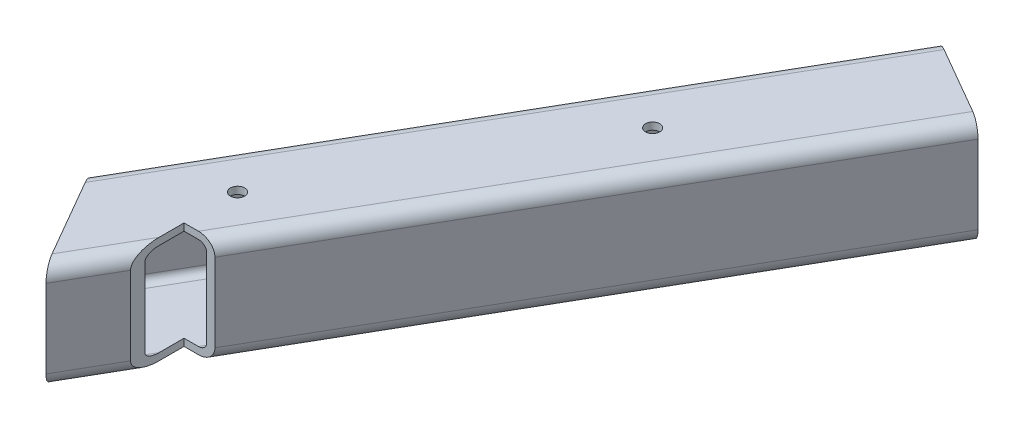
ISO-10303-21;
HEADER;
FILE_DESCRIPTION(('STEP AP214'),'2;1');
FILE_NAME('part.step','',(''),(''),'','','');
FILE_SCHEMA(('AUTOMOTIVE_DESIGN { 1 0 10303 214 1 1 1 1 }'));
ENDSEC;
DATA;
#1=APPLICATION_CONTEXT('core data for automotive mechanical design processes');
#2=APPLICATION_PROTOCOL_DEFINITION('international standard','automotive_design',2000,#1);
#3=PRODUCT_CONTEXT('',#1,'mechanical');
#4=PRODUCT('Part','Part','',(#3));
#5=PRODUCT_RELATED_PRODUCT_CATEGORY('part','',(#4));
#6=PRODUCT_DEFINITION_FORMATION('','',#4);
#7=PRODUCT_DEFINITION_CONTEXT('part definition',#1,'design');
#8=PRODUCT_DEFINITION('design','',#6,#7);
#9=PRODUCT_DEFINITION_SHAPE('','',#8);
#10=(LENGTH_UNIT() NAMED_UNIT(*) SI_UNIT(.MILLI.,.METRE.));
#11=(NAMED_UNIT(*) PLANE_ANGLE_UNIT() SI_UNIT($,.RADIAN.));
#12=(NAMED_UNIT(*) SI_UNIT($,.STERADIAN.) SOLID_ANGLE_UNIT());
#13=UNCERTAINTY_MEASURE_WITH_UNIT(LENGTH_MEASURE(1.E-05),#10,'distance_accuracy_value','');
#14=(GEOMETRIC_REPRESENTATION_CONTEXT(3) GLOBAL_UNCERTAINTY_ASSIGNED_CONTEXT((#13)) GLOBAL_UNIT_ASSIGNED_CONTEXT((#10,
#11,#12)) REPRESENTATION_CONTEXT('',''));
#15=CARTESIAN_POINT('',(0.,0.,0.));
#16=DIRECTION('',(0.,0.,1.));
#17=DIRECTION('',(1.,0.,0.));
#18=AXIS2_PLACEMENT_3D('',#15,#16,#17);
#19=CARTESIAN_POINT('',(57.5262794416286,-11.,-167.705080756888));
#20=DIRECTION('',(-0.499999999999998,0.,0.86602540378444));
#21=DIRECTION('',(0.86602540378444,0.,0.499999999999998));
#22=AXIS2_PLACEMENT_3D('',#19,#20,#21);
#23=CYLINDRICAL_SURFACE('',#22,4.);
#24=DIRECTION('',(-0.499999999999998,0.,0.86602540378444));
#25=VECTOR('',#24,1.);
#26=CARTESIAN_POINT('',(57.5262794416286,-15.,-167.705080756888));
#27=LINE('',#26,#25);
#28=CARTESIAN_POINT('',(-26.0000000000002,-15.,-23.0333209967901));
#29=VERTEX_POINT('',#28);
#30=CARTESIAN_POINT('',(-36.9888930010696,-15.,-3.9999999999997));
#31=VERTEX_POINT('',#30);
#32=EDGE_CURVE('E409',#29,#31,#27,.T.);
#33=ORIENTED_EDGE('',*,*,#32,.F.);
#34=CARTESIAN_POINT('',(-26.0000000000001,-11.,-23.0333209967901));
#35=DIRECTION('',(-1.,0.,0.));
#36=DIRECTION('',(0.,0.,1.));
#37=AXIS2_PLACEMENT_3D('',#34,#35,#36);
#38=ELLIPSE('',#37,8.00000000000002,4.);
#39=CARTESIAN_POINT('',(-26.0000000000001,-11.,-15.0333209967901));
#40=VERTEX_POINT('',#39);
#41=EDGE_CURVE('E262',#29,#40,#38,.T.);
#42=ORIENTED_EDGE('',*,*,#41,.T.);
#43=DIRECTION('',(-0.499999999999998,0.,0.86602540378444));
#44=VECTOR('',#43,1.);
#45=CARTESIAN_POINT('',(60.9903810567664,-11.,-165.705080756888));
#46=LINE('',#45,#44);
#47=CARTESIAN_POINT('',(-34.6794919243111,-11.,2.4980018054066E-13));
#48=VERTEX_POINT('',#47);
#49=EDGE_CURVE('E387',#40,#48,#46,.T.);
#50=ORIENTED_EDGE('',*,*,#49,.T.);
#51=CARTESIAN_POINT('',(-36.9888930010696,-11.,-3.9999999999997));
#52=DIRECTION('',(0.866025403784435,0.,-0.500000000000007));
#53=DIRECTION('',(0.500000000000007,0.,0.866025403784435));
#54=AXIS2_PLACEMENT_3D('',#51,#52,#53);
#55=ELLIPSE('',#54,4.61880215351699,4.);
#56=EDGE_CURVE('E313',#48,#31,#55,.T.);
#57=ORIENTED_EDGE('',*,*,#56,.T.);
#58=EDGE_LOOP('',(#33,#42,#50,#57));
#59=FACE_BOUND('',#58,.T.);
#60=ADVANCED_FACE('F35',(#59),#23,.T.);
#61=CARTESIAN_POINT('',(57.5262794416286,11.,-167.705080756888));
#62=DIRECTION('',(-0.499999999999998,0.,0.86602540378444));
#63=DIRECTION('',(0.86602540378444,0.,0.499999999999998));
#64=AXIS2_PLACEMENT_3D('',#61,#62,#63);
#65=CYLINDRICAL_SURFACE('',#64,4.);
#66=DIRECTION('',(-0.499999999999998,0.,0.86602540378444));
#67=VECTOR('',#66,1.);
#68=CARTESIAN_POINT('',(60.9903810567664,11.,-165.705080756888));
#69=LINE('',#68,#67);
#70=CARTESIAN_POINT('',(-26.0000000000001,11.,-15.0333209967901));
#71=VERTEX_POINT('',#70);
#72=CARTESIAN_POINT('',(-34.6794919243111,11.,2.77555756156289E-13));
#73=VERTEX_POINT('',#72);
#74=EDGE_CURVE('E391',#71,#73,#69,.T.);
#75=ORIENTED_EDGE('',*,*,#74,.F.);
#76=CARTESIAN_POINT('',(-26.0000000000001,11.,-23.0333209967901));
#77=DIRECTION('',(-1.,0.,0.));
#78=DIRECTION('',(0.,0.,1.));
#79=AXIS2_PLACEMENT_3D('',#76,#77,#78);
#80=ELLIPSE('',#79,8.00000000000003,4.);
#81=CARTESIAN_POINT('',(-26.0000000000001,15.,-23.0333209967901));
#82=VERTEX_POINT('',#81);
#83=EDGE_CURVE('E260',#71,#82,#80,.T.);
#84=ORIENTED_EDGE('',*,*,#83,.T.);
#85=DIRECTION('',(-0.499999999999998,0.,0.86602540378444));
#86=VECTOR('',#85,1.);
#87=CARTESIAN_POINT('',(57.5262794416286,15.,-167.705080756888));
#88=LINE('',#87,#86);
#89=CARTESIAN_POINT('',(-36.9888930010696,15.,-3.99999999999974));
#90=VERTEX_POINT('',#89);
#91=EDGE_CURVE('E230',#82,#90,#88,.T.);
#92=ORIENTED_EDGE('',*,*,#91,.T.);
#93=CARTESIAN_POINT('',(-36.9888930010696,11.,-3.9999999999997));
#94=DIRECTION('',(0.866025403784435,0.,-0.500000000000007));
#95=DIRECTION('',(0.500000000000007,0.,0.866025403784435));
#96=AXIS2_PLACEMENT_3D('',#93,#94,#95);
#97=ELLIPSE('',#96,4.61880215351699,4.);
#98=EDGE_CURVE('E310',#90,#73,#97,.T.);
#99=ORIENTED_EDGE('',*,*,#98,.T.);
#100=EDGE_LOOP('',(#75,#84,#92,#99));
#101=FACE_BOUND('',#100,.T.);
#102=ADVANCED_FACE('F483',(#101),#65,.T.);
#103=CARTESIAN_POINT('',(60.9903810567664,-11.,-165.705080756888));
#104=DIRECTION('',(-0.86602540378444,0.,-0.499999999999998));
#105=DIRECTION('',(-0.499999999999998,0.,0.86602540378444));
#106=AXIS2_PLACEMENT_3D('',#103,#104,#105);
#107=PLANE('',#106);
#108=ORIENTED_EDGE('',*,*,#49,.F.);
#109=DIRECTION('',(0.,1.,0.));
#110=VECTOR('',#109,1.);
#111=CARTESIAN_POINT('',(-26.0000000000001,-11.,-15.0333209967901));
#112=LINE('',#111,#110);
#113=EDGE_CURVE('E257',#40,#71,#112,.T.);
#114=ORIENTED_EDGE('',*,*,#113,.T.);
#115=ORIENTED_EDGE('',*,*,#74,.T.);
#116=DIRECTION('',(0.,-1.,0.));
#117=VECTOR('',#116,1.);
#118=CARTESIAN_POINT('',(-34.6794919243111,-11.,2.77555756156289E-13));
#119=LINE('',#118,#117);
#120=EDGE_CURVE('E307',#73,#48,#119,.T.);
#121=ORIENTED_EDGE('',*,*,#120,.T.);
#122=EDGE_LOOP('',(#108,#114,#115,#121));
#123=FACE_BOUND('',#122,.T.);
#124=ADVANCED_FACE('F480',(#123),#107,.F.);
#125=CARTESIAN_POINT('',(57.5262794416286,-11.,-167.705080756888));
#126=DIRECTION('',(-0.499999999999998,0.,0.86602540378444));
#127=DIRECTION('',(0.86602540378444,0.,0.499999999999998));
#128=AXIS2_PLACEMENT_3D('',#125,#126,#127);
#129=CYLINDRICAL_SURFACE('',#128,2.);
#130=CARTESIAN_POINT('',(-26.0000000000001,-11.,-23.0333209967901));
#131=DIRECTION('',(-1.,0.,0.));
#132=DIRECTION('',(0.,0.,1.));
#133=AXIS2_PLACEMENT_3D('',#130,#131,#132);
#134=ELLIPSE('',#133,4.00000000000001,2.);
#135=CARTESIAN_POINT('',(-26.0000000000001,-13.,-23.0333209967901));
#136=VERTEX_POINT('',#135);
#137=CARTESIAN_POINT('',(-26.0000000000001,-11.,-19.0333209967901));
#138=VERTEX_POINT('',#137);
#139=EDGE_CURVE('E253',#136,#138,#134,.T.);
#140=ORIENTED_EDGE('',*,*,#139,.F.);
#141=DIRECTION('',(-0.499999999999998,0.,0.86602540378444));
#142=VECTOR('',#141,1.);
#143=CARTESIAN_POINT('',(57.5262794416286,-13.,-167.705080756888));
#144=LINE('',#143,#142);
#145=CARTESIAN_POINT('',(-36.9888930010696,-13.,-3.99999999999968));
#146=VERTEX_POINT('',#145);
#147=EDGE_CURVE('E366',#136,#146,#144,.T.);
#148=ORIENTED_EDGE('',*,*,#147,.T.);
#149=CARTESIAN_POINT('',(-36.9888930010696,-11.,-3.9999999999997));
#150=DIRECTION('',(0.866025403784435,0.,-0.500000000000007));
#151=DIRECTION('',(0.500000000000007,0.,0.866025403784435));
#152=AXIS2_PLACEMENT_3D('',#149,#150,#151);
#153=ELLIPSE('',#152,2.30940107675849,2.);
#154=CARTESIAN_POINT('',(-35.8341924626903,-11.,-1.9999999999997));
#155=VERTEX_POINT('',#154);
#156=EDGE_CURVE('E304',#155,#146,#153,.T.);
#157=ORIENTED_EDGE('',*,*,#156,.F.);
#158=DIRECTION('',(-0.499999999999998,0.,0.86602540378444));
#159=VECTOR('',#158,1.);
#160=CARTESIAN_POINT('',(59.2583302491975,-11.,-166.705080756888));
#161=LINE('',#160,#159);
#162=EDGE_CURVE('E342',#138,#155,#161,.T.);
#163=ORIENTED_EDGE('',*,*,#162,.F.);
#164=EDGE_LOOP('',(#140,#148,#157,#163));
#165=FACE_BOUND('',#164,.T.);
#166=ADVANCED_FACE('F490',(#165),#129,.F.);
#167=CARTESIAN_POINT('',(57.5262794416286,11.,-167.705080756888));
#168=DIRECTION('',(-0.499999999999998,0.,0.86602540378444));
#169=DIRECTION('',(0.86602540378444,0.,0.499999999999998));
#170=AXIS2_PLACEMENT_3D('',#167,#168,#169);
#171=CYLINDRICAL_SURFACE('',#170,2.);
#172=CARTESIAN_POINT('',(-26.0000000000001,11.,-23.0333209967901));
#173=DIRECTION('',(-1.,0.,0.));
#174=DIRECTION('',(0.,0.,1.));
#175=AXIS2_PLACEMENT_3D('',#172,#173,#174);
#176=ELLIPSE('',#175,4.00000000000002,2.);
#177=CARTESIAN_POINT('',(-26.0000000000001,11.,-19.0333209967901));
#178=VERTEX_POINT('',#177);
#179=CARTESIAN_POINT('',(-26.0000000000001,13.,-23.0333209967901));
#180=VERTEX_POINT('',#179);
#181=EDGE_CURVE('E250',#178,#180,#176,.T.);
#182=ORIENTED_EDGE('',*,*,#181,.F.);
#183=DIRECTION('',(-0.499999999999998,0.,0.86602540378444));
#184=VECTOR('',#183,1.);
#185=CARTESIAN_POINT('',(59.2583302491975,11.,-166.705080756888));
#186=LINE('',#185,#184);
#187=CARTESIAN_POINT('',(-35.8341924626903,11.,-1.99999999999972));
#188=VERTEX_POINT('',#187);
#189=EDGE_CURVE('E346',#178,#188,#186,.T.);
#190=ORIENTED_EDGE('',*,*,#189,.T.);
#191=CARTESIAN_POINT('',(-36.9888930010696,11.,-3.9999999999997));
#192=DIRECTION('',(0.866025403784435,0.,-0.500000000000007));
#193=DIRECTION('',(0.500000000000007,0.,0.866025403784435));
#194=AXIS2_PLACEMENT_3D('',#191,#192,#193);
#195=ELLIPSE('',#194,2.3094010767585,2.);
#196=CARTESIAN_POINT('',(-36.9888930010696,13.,-3.99999999999973));
#197=VERTEX_POINT('',#196);
#198=EDGE_CURVE('E290',#197,#188,#195,.T.);
#199=ORIENTED_EDGE('',*,*,#198,.F.);
#200=DIRECTION('',(-0.499999999999998,0.,0.86602540378444));
#201=VECTOR('',#200,1.);
#202=CARTESIAN_POINT('',(57.5262794416286,13.,-167.705080756888));
#203=LINE('',#202,#201);
#204=EDGE_CURVE('E350',#180,#197,#203,.T.);
#205=ORIENTED_EDGE('',*,*,#204,.F.);
#206=EDGE_LOOP('',(#182,#190,#199,#205));
#207=FACE_BOUND('',#206,.T.);
#208=ADVANCED_FACE('F555',(#207),#171,.F.);
#209=CARTESIAN_POINT('',(59.2583302491975,-11.,-166.705080756888));
#210=DIRECTION('',(-0.86602540378444,0.,-0.499999999999998));
#211=DIRECTION('',(-0.499999999999998,0.,0.86602540378444));
#212=AXIS2_PLACEMENT_3D('',#209,#210,#211);
#213=PLANE('',#212);
#214=DIRECTION('',(0.,1.,0.));
#215=VECTOR('',#214,1.);
#216=CARTESIAN_POINT('',(-26.0000000000001,-11.0000000000001,-19.0333209967901));
#217=LINE('',#216,#215);
#218=EDGE_CURVE('E11',#138,#178,#217,.T.);
#219=ORIENTED_EDGE('',*,*,#218,.F.);
#220=ORIENTED_EDGE('',*,*,#162,.T.);
#221=DIRECTION('',(0.,-1.,0.));
#222=VECTOR('',#221,1.);
#223=CARTESIAN_POINT('',(-35.8341924626903,-11.,-1.9999999999997));
#224=LINE('',#223,#222);
#225=EDGE_CURVE('E413',#188,#155,#224,.T.);
#226=ORIENTED_EDGE('',*,*,#225,.F.);
#227=ORIENTED_EDGE('',*,*,#189,.F.);
#228=EDGE_LOOP('',(#219,#220,#226,#227));
#229=FACE_BOUND('',#228,.T.);
#230=ADVANCED_FACE('F574',(#229),#213,.T.);
#231=CARTESIAN_POINT('',(57.5262794416286,-11.,-167.705080756888));
#232=DIRECTION('',(-0.499999999999998,0.,0.86602540378444));
#233=DIRECTION('',(0.86602540378444,0.,0.499999999999998));
#234=AXIS2_PLACEMENT_3D('',#231,#232,#233);
#235=PLANE('',#234);
#236=CARTESIAN_POINT('',(57.5262794416286,-11.,-167.705080756888));
#237=DIRECTION('',(0.499999999999998,0.,-0.86602540378444));
#238=DIRECTION('',(0.86602540378444,0.,0.499999999999998));
#239=AXIS2_PLACEMENT_3D('',#236,#237,#238);
#240=CIRCLE('',#239,4.);
#241=CARTESIAN_POINT('',(60.9903810567664,-11.,-165.705080756888));
#242=VERTEX_POINT('',#241);
#243=CARTESIAN_POINT('',(57.5262794416286,-15.,-167.705080756888));
#244=VERTEX_POINT('',#243);
#245=EDGE_CURVE('E370',#242,#244,#240,.T.);
#246=ORIENTED_EDGE('',*,*,#245,.T.);
#247=DIRECTION('',(-0.86602540378444,0.,-0.499999999999998));
#248=VECTOR('',#247,1.);
#249=CARTESIAN_POINT('',(57.5262794416286,-15.,-167.705080756888));
#250=LINE('',#249,#248);
#251=CARTESIAN_POINT('',(38.473720558371,-15.,-178.705080756888));
#252=VERTEX_POINT('',#251);
#253=EDGE_CURVE('E373',#244,#252,#250,.T.);
#254=ORIENTED_EDGE('',*,*,#253,.T.);
#255=CARTESIAN_POINT('',(38.4737205583709,-11.,-178.705080756888));
#256=DIRECTION('',(0.499999999999998,0.,-0.86602540378444));
#257=DIRECTION('',(-0.86602540378444,0.,-0.499999999999998));
#258=AXIS2_PLACEMENT_3D('',#255,#256,#257);
#259=CIRCLE('',#258,4.);
#260=CARTESIAN_POINT('',(35.0096189432332,-11.,-180.705080756888));
#261=VERTEX_POINT('',#260);
#262=EDGE_CURVE('E375',#252,#261,#259,.T.);
#263=ORIENTED_EDGE('',*,*,#262,.T.);
#264=DIRECTION('',(0.,1.,0.));
#265=VECTOR('',#264,1.);
#266=CARTESIAN_POINT('',(35.0096189432332,-11.,-180.705080756888));
#267=LINE('',#266,#265);
#268=CARTESIAN_POINT('',(35.0096189432332,11.,-180.705080756888));
#269=VERTEX_POINT('',#268);
#270=EDGE_CURVE('E377',#261,#269,#267,.T.);
#271=ORIENTED_EDGE('',*,*,#270,.T.);
#272=CARTESIAN_POINT('',(38.4737205583709,11.,-178.705080756888));
#273=DIRECTION('',(0.499999999999998,0.,-0.86602540378444));
#274=DIRECTION('',(0.86602540378444,0.,0.499999999999998));
#275=AXIS2_PLACEMENT_3D('',#272,#273,#274);
#276=CIRCLE('',#275,4.);
#277=CARTESIAN_POINT('',(38.473720558371,15.,-178.705080756888));
#278=VERTEX_POINT('',#277);
#279=EDGE_CURVE('E379',#269,#278,#276,.T.);
#280=ORIENTED_EDGE('',*,*,#279,.T.);
#281=DIRECTION('',(0.86602540378444,0.,0.499999999999998));
#282=VECTOR('',#281,1.);
#283=CARTESIAN_POINT('',(57.5262794416286,15.,-167.705080756888));
#284=LINE('',#283,#282);
#285=CARTESIAN_POINT('',(57.5262794416286,15.,-167.705080756888));
#286=VERTEX_POINT('',#285);
#287=EDGE_CURVE('E381',#278,#286,#284,.T.);
#288=ORIENTED_EDGE('',*,*,#287,.T.);
#289=CARTESIAN_POINT('',(57.5262794416286,11.,-167.705080756888));
#290=DIRECTION('',(0.499999999999998,0.,-0.86602540378444));
#291=DIRECTION('',(0.86602540378444,0.,0.499999999999998));
#292=AXIS2_PLACEMENT_3D('',#289,#290,#291);
#293=CIRCLE('',#292,4.);
#294=CARTESIAN_POINT('',(60.9903810567664,11.,-165.705080756888));
#295=VERTEX_POINT('',#294);
#296=EDGE_CURVE('E383',#286,#295,#293,.T.);
#297=ORIENTED_EDGE('',*,*,#296,.T.);
#298=DIRECTION('',(0.,-1.,0.));
#299=VECTOR('',#298,1.);
#300=CARTESIAN_POINT('',(60.9903810567664,-11.,-165.705080756888));
#301=LINE('',#300,#299);
#302=EDGE_CURVE('E385',#295,#242,#301,.T.);
#303=ORIENTED_EDGE('',*,*,#302,.T.);
#304=EDGE_LOOP('',(#246,#254,#263,#271,#280,#288,#297,#303));
#305=FACE_BOUND('',#304,.T.);
#306=CARTESIAN_POINT('',(57.5262794416286,-11.,-167.705080756888));
#307=DIRECTION('',(0.499999999999998,0.,-0.86602540378444));
#308=DIRECTION('',(0.86602540378444,0.,0.499999999999998));
#309=AXIS2_PLACEMENT_3D('',#306,#307,#308);
#310=CIRCLE('',#309,2.);
#311=CARTESIAN_POINT('',(59.2583302491975,-11.,-166.705080756888));
#312=VERTEX_POINT('',#311);
#313=CARTESIAN_POINT('',(57.5262794416286,-13.,-167.705080756888));
#314=VERTEX_POINT('',#313);
#315=EDGE_CURVE('E325',#312,#314,#310,.T.);
#316=ORIENTED_EDGE('',*,*,#315,.F.);
#317=DIRECTION('',(0.,-1.,0.));
#318=VECTOR('',#317,1.);
#319=CARTESIAN_POINT('',(59.2583302491975,-11.,-166.705080756888));
#320=LINE('',#319,#318);
#321=CARTESIAN_POINT('',(59.2583302491975,11.,-166.705080756888));
#322=VERTEX_POINT('',#321);
#323=EDGE_CURVE('E340',#322,#312,#320,.T.);
#324=ORIENTED_EDGE('',*,*,#323,.F.);
#325=CARTESIAN_POINT('',(57.5262794416286,11.,-167.705080756888));
#326=DIRECTION('',(0.499999999999998,0.,-0.86602540378444));
#327=DIRECTION('',(0.86602540378444,0.,0.499999999999998));
#328=AXIS2_PLACEMENT_3D('',#325,#326,#327);
#329=CIRCLE('',#328,2.);
#330=CARTESIAN_POINT('',(57.5262794416286,13.,-167.705080756888));
#331=VERTEX_POINT('',#330);
#332=EDGE_CURVE('E337',#331,#322,#329,.T.);
#333=ORIENTED_EDGE('',*,*,#332,.F.);
#334=DIRECTION('',(0.86602540378444,0.,0.499999999999998));
#335=VECTOR('',#334,1.);
#336=CARTESIAN_POINT('',(57.5262794416286,13.,-167.705080756888));
#337=LINE('',#336,#335);
#338=CARTESIAN_POINT('',(38.473720558371,13.,-178.705080756888));
#339=VERTEX_POINT('',#338);
#340=EDGE_CURVE('E335',#339,#331,#337,.T.);
#341=ORIENTED_EDGE('',*,*,#340,.F.);
#342=CARTESIAN_POINT('',(38.4737205583709,11.,-178.705080756888));
#343=DIRECTION('',(0.499999999999998,0.,-0.86602540378444));
#344=DIRECTION('',(0.86602540378444,0.,0.499999999999998));
#345=AXIS2_PLACEMENT_3D('',#342,#343,#344);
#346=CIRCLE('',#345,2.);
#347=CARTESIAN_POINT('',(36.7416697508021,11.,-179.705080756888));
#348=VERTEX_POINT('',#347);
#349=EDGE_CURVE('E333',#348,#339,#346,.T.);
#350=ORIENTED_EDGE('',*,*,#349,.F.);
#351=DIRECTION('',(0.,1.,0.));
#352=VECTOR('',#351,1.);
#353=CARTESIAN_POINT('',(36.7416697508021,-11.,-179.705080756888));
#354=LINE('',#353,#352);
#355=CARTESIAN_POINT('',(36.7416697508021,-11.,-179.705080756888));
#356=VERTEX_POINT('',#355);
#357=EDGE_CURVE('E331',#356,#348,#354,.T.);
#358=ORIENTED_EDGE('',*,*,#357,.F.);
#359=CARTESIAN_POINT('',(38.4737205583709,-11.,-178.705080756888));
#360=DIRECTION('',(0.499999999999998,0.,-0.86602540378444));
#361=DIRECTION('',(-0.86602540378444,0.,-0.499999999999998));
#362=AXIS2_PLACEMENT_3D('',#359,#360,#361);
#363=CIRCLE('',#362,2.);
#364=CARTESIAN_POINT('',(38.473720558371,-13.,-178.705080756888));
#365=VERTEX_POINT('',#364);
#366=EDGE_CURVE('E329',#365,#356,#363,.T.);
#367=ORIENTED_EDGE('',*,*,#366,.F.);
#368=DIRECTION('',(-0.86602540378444,0.,-0.499999999999998));
#369=VECTOR('',#368,1.);
#370=CARTESIAN_POINT('',(57.5262794416286,-13.,-167.705080756888));
#371=LINE('',#370,#369);
#372=EDGE_CURVE('E327',#314,#365,#371,.T.);
#373=ORIENTED_EDGE('',*,*,#372,.F.);
#374=EDGE_LOOP('',(#316,#324,#333,#341,#350,#358,#367,#373));
#375=FACE_BOUND('',#374,.T.);
#376=ADVANCED_FACE('F431',(#305,#375),#235,.F.);
#377=CARTESIAN_POINT('',(-17.3397459621554,-11.,-30.0333209967908));
#378=VERTEX_POINT('',#377);
#379=EDGE_CURVE('E388',#242,#378,#46,.T.);
#380=ORIENTED_EDGE('',*,*,#379,.T.);
#381=CARTESIAN_POINT('',(-21.9585481156724,-11.,-30.0333209967907));
#382=DIRECTION('',(0.,0.,-1.));
#383=DIRECTION('',(-1.,0.,0.));
#384=AXIS2_PLACEMENT_3D('',#381,#382,#383);
#385=ELLIPSE('',#384,4.618802153517,4.);
#386=CARTESIAN_POINT('',(-21.9585481156724,-15.,-30.0333209967908));
#387=VERTEX_POINT('',#386);
#388=EDGE_CURVE('E50',#378,#387,#385,.T.);
#389=ORIENTED_EDGE('',*,*,#388,.T.);
#390=EDGE_CURVE('E410',#244,#387,#27,.T.);
#391=ORIENTED_EDGE('',*,*,#390,.F.);
#392=ORIENTED_EDGE('',*,*,#245,.F.);
#393=EDGE_LOOP('',(#380,#389,#391,#392));
#394=FACE_BOUND('',#393,.T.);
#395=ADVANCED_FACE('F37',(#394),#23,.T.);
#396=CARTESIAN_POINT('',(57.5262794416286,-15.,-167.705080756888));
#397=DIRECTION('',(0.,1.,0.));
#398=DIRECTION('',(0.,0.,1.));
#399=AXIS2_PLACEMENT_3D('',#396,#397,#398);
#400=PLANE('',#399);
#401=CARTESIAN_POINT('',(-26.0000000000002,-15.,-45.0333209967906));
#402=DIRECTION('',(0.,1.,0.));
#403=DIRECTION('',(0.,0.,1.));
#404=AXIS2_PLACEMENT_3D('',#401,#402,#403);
#405=CIRCLE('',#404,2.);
#406=CARTESIAN_POINT('',(-26.0000000000002,-15.,-43.0333209967906));
#407=VERTEX_POINT('',#406);
#408=EDGE_CURVE('E269',#407,#407,#405,.T.);
#409=ORIENTED_EDGE('',*,*,#408,.T.);
#410=EDGE_LOOP('',(#409));
#411=FACE_BOUND('',#410,.T.);
#412=CARTESIAN_POINT('',(16.6147462459374,-15.,-118.844226646409));
#413=DIRECTION('',(0.,1.,0.));
#414=DIRECTION('',(0.,0.,1.));
#415=AXIS2_PLACEMENT_3D('',#412,#413,#414);
#416=CIRCLE('',#415,2.00000000000002);
#417=CARTESIAN_POINT('',(16.6147462459374,-15.,-116.844226646409));
#418=VERTEX_POINT('',#417);
#419=EDGE_CURVE('E270',#418,#418,#416,.T.);
#420=ORIENTED_EDGE('',*,*,#419,.T.);
#421=EDGE_LOOP('',(#420));
#422=FACE_BOUND('',#421,.T.);
#423=DIRECTION('',(-1.,0.,0.));
#424=VECTOR('',#423,1.);
#425=CARTESIAN_POINT('',(25.9999999999998,-15.,-30.0333209967908));
#426=LINE('',#425,#424);
#427=CARTESIAN_POINT('',(-26.0000000000002,-15.,-30.0333209967908));
#428=VERTEX_POINT('',#427);
#429=EDGE_CURVE('E231',#387,#428,#426,.T.);
#430=ORIENTED_EDGE('',*,*,#429,.T.);
#431=DIRECTION('',(0.,0.,1.));
#432=VECTOR('',#431,1.);
#433=CARTESIAN_POINT('',(-26.0000000000002,-15.,-30.0333209967908));
#434=LINE('',#433,#432);
#435=EDGE_CURVE('E225',#428,#29,#434,.T.);
#436=ORIENTED_EDGE('',*,*,#435,.T.);
#437=ORIENTED_EDGE('',*,*,#32,.T.);
#438=DIRECTION('',(-0.500000000000007,0.,-0.866025403784435));
#439=VECTOR('',#438,1.);
#440=CARTESIAN_POINT('',(2.85111161261304,-15.,65.0049121646758));
#441=LINE('',#440,#439);
#442=CARTESIAN_POINT('',(-49.6905989232415,-15.,-25.9999999999996));
#443=VERTEX_POINT('',#442);
#444=EDGE_CURVE('E287',#31,#443,#441,.T.);
#445=ORIENTED_EDGE('',*,*,#444,.T.);
#446=DIRECTION('',(-0.499999999999998,0.,0.86602540378444));
#447=VECTOR('',#446,1.);
#448=CARTESIAN_POINT('',(38.473720558371,-15.,-178.705080756888));
#449=LINE('',#448,#447);
#450=EDGE_CURVE('E406',#252,#443,#449,.T.);
#451=ORIENTED_EDGE('',*,*,#450,.F.);
#452=ORIENTED_EDGE('',*,*,#253,.F.);
#453=ORIENTED_EDGE('',*,*,#390,.T.);
#454=EDGE_LOOP('',(#430,#436,#437,#445,#451,#452,#453));
#455=FACE_BOUND('',#454,.T.);
#456=ADVANCED_FACE('F444',(#411,#422,#455),#400,.F.);
#457=CARTESIAN_POINT('',(38.4737205583709,-11.,-178.705080756888));
#458=DIRECTION('',(-0.499999999999998,0.,0.86602540378444));
#459=DIRECTION('',(0.86602540378444,0.,0.499999999999998));
#460=AXIS2_PLACEMENT_3D('',#457,#458,#459);
#461=CYLINDRICAL_SURFACE('',#460,4.);
#462=ORIENTED_EDGE('',*,*,#450,.T.);
#463=CARTESIAN_POINT('',(-49.6905989232415,-11.,-25.9999999999995));
#464=DIRECTION('',(0.866025403784435,0.,-0.500000000000007));
#465=DIRECTION('',(0.500000000000007,0.,0.866025403784435));
#466=AXIS2_PLACEMENT_3D('',#463,#464,#465);
#467=ELLIPSE('',#466,4.61880215351699,4.);
#468=CARTESIAN_POINT('',(-52.,-11.,-29.9999999999995));
#469=VERTEX_POINT('',#468);
#470=EDGE_CURVE('E322',#443,#469,#467,.T.);
#471=ORIENTED_EDGE('',*,*,#470,.T.);
#472=DIRECTION('',(-0.499999999999998,0.,0.86602540378444));
#473=VECTOR('',#472,1.);
#474=CARTESIAN_POINT('',(35.0096189432332,-11.,-180.705080756888));
#475=LINE('',#474,#473);
#476=EDGE_CURVE('E403',#261,#469,#475,.T.);
#477=ORIENTED_EDGE('',*,*,#476,.F.);
#478=ORIENTED_EDGE('',*,*,#262,.F.);
#479=EDGE_LOOP('',(#462,#471,#477,#478));
#480=FACE_BOUND('',#479,.T.);
#481=ADVANCED_FACE('F473',(#480),#461,.T.);
#482=CARTESIAN_POINT('',(35.0096189432332,-11.,-180.705080756888));
#483=DIRECTION('',(0.86602540378444,0.,0.499999999999998));
#484=DIRECTION('',(0.499999999999998,0.,-0.86602540378444));
#485=AXIS2_PLACEMENT_3D('',#482,#483,#484);
#486=PLANE('',#485);
#487=ORIENTED_EDGE('',*,*,#476,.T.);
#488=DIRECTION('',(0.,1.,0.));
#489=VECTOR('',#488,1.);
#490=CARTESIAN_POINT('',(-52.,-11.,-29.9999999999995));
#491=LINE('',#490,#489);
#492=CARTESIAN_POINT('',(-52.,11.,-29.9999999999995));
#493=VERTEX_POINT('',#492);
#494=EDGE_CURVE('E319',#469,#493,#491,.T.);
#495=ORIENTED_EDGE('',*,*,#494,.T.);
#496=DIRECTION('',(-0.499999999999998,0.,0.86602540378444));
#497=VECTOR('',#496,1.);
#498=CARTESIAN_POINT('',(35.0096189432332,11.,-180.705080756888));
#499=LINE('',#498,#497);
#500=EDGE_CURVE('E400',#269,#493,#499,.T.);
#501=ORIENTED_EDGE('',*,*,#500,.F.);
#502=ORIENTED_EDGE('',*,*,#270,.F.);
#503=EDGE_LOOP('',(#487,#495,#501,#502));
#504=FACE_BOUND('',#503,.T.);
#505=ADVANCED_FACE('F469',(#504),#486,.F.);
#506=CARTESIAN_POINT('',(38.4737205583709,11.,-178.705080756888));
#507=DIRECTION('',(-0.499999999999998,0.,0.86602540378444));
#508=DIRECTION('',(0.86602540378444,0.,0.499999999999998));
#509=AXIS2_PLACEMENT_3D('',#506,#507,#508);
#510=CYLINDRICAL_SURFACE('',#509,4.);
#511=ORIENTED_EDGE('',*,*,#500,.T.);
#512=CARTESIAN_POINT('',(-49.6905989232415,11.,-25.9999999999995));
#513=DIRECTION('',(0.866025403784435,0.,-0.500000000000007));
#514=DIRECTION('',(0.500000000000007,0.,0.866025403784435));
#515=AXIS2_PLACEMENT_3D('',#512,#513,#514);
#516=ELLIPSE('',#515,4.61880215351699,4.);
#517=CARTESIAN_POINT('',(-49.6905989232414,15.,-25.9999999999994));
#518=VERTEX_POINT('',#517);
#519=EDGE_CURVE('E316',#493,#518,#516,.T.);
#520=ORIENTED_EDGE('',*,*,#519,.T.);
#521=DIRECTION('',(-0.499999999999998,0.,0.86602540378444));
#522=VECTOR('',#521,1.);
#523=CARTESIAN_POINT('',(38.473720558371,15.,-178.705080756888));
#524=LINE('',#523,#522);
#525=EDGE_CURVE('E397',#278,#518,#524,.T.);
#526=ORIENTED_EDGE('',*,*,#525,.F.);
#527=ORIENTED_EDGE('',*,*,#279,.F.);
#528=EDGE_LOOP('',(#511,#520,#526,#527));
#529=FACE_BOUND('',#528,.T.);
#530=ADVANCED_FACE('F463',(#529),#510,.T.);
#531=CARTESIAN_POINT('',(57.5262794416286,15.,-167.705080756888));
#532=DIRECTION('',(0.,-1.,0.));
#533=DIRECTION('',(0.,0.,-1.));
#534=AXIS2_PLACEMENT_3D('',#531,#532,#533);
#535=PLANE('',#534);
#536=CARTESIAN_POINT('',(-26.0000000000002,15.,-45.0333209967906));
#537=DIRECTION('',(0.,1.,0.));
#538=DIRECTION('',(0.,0.,1.));
#539=AXIS2_PLACEMENT_3D('',#536,#537,#538);
#540=CIRCLE('',#539,2.);
#541=CARTESIAN_POINT('',(-26.0000000000002,15.,-43.0333209967906));
#542=VERTEX_POINT('',#541);
#543=EDGE_CURVE('E266',#542,#542,#540,.T.);
#544=ORIENTED_EDGE('',*,*,#543,.F.);
#545=EDGE_LOOP('',(#544));
#546=FACE_BOUND('',#545,.T.);
#547=CARTESIAN_POINT('',(16.6147462459374,15.,-118.844226646409));
#548=DIRECTION('',(0.,1.,0.));
#549=DIRECTION('',(0.,0.,1.));
#550=AXIS2_PLACEMENT_3D('',#547,#548,#549);
#551=CIRCLE('',#550,2.00000000000002);
#552=CARTESIAN_POINT('',(16.6147462459374,15.,-116.844226646409));
#553=VERTEX_POINT('',#552);
#554=EDGE_CURVE('E265',#553,#553,#551,.T.);
#555=ORIENTED_EDGE('',*,*,#554,.F.);
#556=EDGE_LOOP('',(#555));
#557=FACE_BOUND('',#556,.T.);
#558=ORIENTED_EDGE('',*,*,#91,.F.);
#559=DIRECTION('',(0.,0.,1.));
#560=VECTOR('',#559,1.);
#561=CARTESIAN_POINT('',(-26.0000000000002,15.,-30.0333209967908));
#562=LINE('',#561,#560);
#563=CARTESIAN_POINT('',(-26.0000000000002,15.,-30.0333209967908));
#564=VERTEX_POINT('',#563);
#565=EDGE_CURVE('E216',#564,#82,#562,.T.);
#566=ORIENTED_EDGE('',*,*,#565,.F.);
#567=DIRECTION('',(-1.,0.,0.));
#568=VECTOR('',#567,1.);
#569=CARTESIAN_POINT('',(25.9999999999998,15.,-30.0333209967908));
#570=LINE('',#569,#568);
#571=CARTESIAN_POINT('',(-21.9585481156724,15.,-30.0333209967908));
#572=VERTEX_POINT('',#571);
#573=EDGE_CURVE('E205',#572,#564,#570,.T.);
#574=ORIENTED_EDGE('',*,*,#573,.F.);
#575=EDGE_CURVE('E395',#286,#572,#88,.T.);
#576=ORIENTED_EDGE('',*,*,#575,.F.);
#577=ORIENTED_EDGE('',*,*,#287,.F.);
#578=ORIENTED_EDGE('',*,*,#525,.T.);
#579=DIRECTION('',(-0.500000000000007,0.,-0.866025403784435));
#580=VECTOR('',#579,1.);
#581=CARTESIAN_POINT('',(2.85111161261304,15.,65.0049121646758));
#582=LINE('',#581,#580);
#583=EDGE_CURVE('E285',#90,#518,#582,.T.);
#584=ORIENTED_EDGE('',*,*,#583,.F.);
#585=EDGE_LOOP('',(#558,#566,#574,#576,#577,#578,#584));
#586=FACE_BOUND('',#585,.T.);
#587=ADVANCED_FACE('F228',(#546,#557,#586),#535,.F.);
#588=ORIENTED_EDGE('',*,*,#575,.T.);
#589=CARTESIAN_POINT('',(-21.9585481156724,11.,-30.0333209967907));
#590=DIRECTION('',(0.,0.,-1.));
#591=DIRECTION('',(-1.,0.,0.));
#592=AXIS2_PLACEMENT_3D('',#589,#590,#591);
#593=ELLIPSE('',#592,4.618802153517,4.);
#594=CARTESIAN_POINT('',(-17.3397459621554,11.,-30.0333209967908));
#595=VERTEX_POINT('',#594);
#596=EDGE_CURVE('E211',#572,#595,#593,.T.);
#597=ORIENTED_EDGE('',*,*,#596,.T.);
#598=EDGE_CURVE('E392',#295,#595,#69,.T.);
#599=ORIENTED_EDGE('',*,*,#598,.F.);
#600=ORIENTED_EDGE('',*,*,#296,.F.);
#601=EDGE_LOOP('',(#588,#597,#599,#600));
#602=FACE_BOUND('',#601,.T.);
#603=ADVANCED_FACE('F454',(#602),#65,.T.);
#604=ORIENTED_EDGE('',*,*,#598,.T.);
#605=DIRECTION('',(0.,-1.,0.));
#606=VECTOR('',#605,1.);
#607=CARTESIAN_POINT('',(-17.3397459621554,-11.,-30.0333209967908));
#608=LINE('',#607,#606);
#609=EDGE_CURVE('E246',#595,#378,#608,.T.);
#610=ORIENTED_EDGE('',*,*,#609,.T.);
#611=ORIENTED_EDGE('',*,*,#379,.F.);
#612=ORIENTED_EDGE('',*,*,#302,.F.);
#613=EDGE_LOOP('',(#604,#610,#611,#612));
#614=FACE_BOUND('',#613,.T.);
#615=ADVANCED_FACE('F451',(#614),#107,.F.);
#616=CARTESIAN_POINT('',(-21.9585481156724,-11.,-30.0333209967907));
#617=DIRECTION('',(0.,0.,-1.));
#618=DIRECTION('',(-1.,0.,0.));
#619=AXIS2_PLACEMENT_3D('',#616,#617,#618);
#620=ELLIPSE('',#619,2.3094010767585,2.);
#621=CARTESIAN_POINT('',(-19.6491470389139,-11.,-30.0333209967907));
#622=VERTEX_POINT('',#621);
#623=CARTESIAN_POINT('',(-21.9585481156725,-13.,-30.0333209967907));
#624=VERTEX_POINT('',#623);
#625=EDGE_CURVE('E242',#622,#624,#620,.T.);
#626=ORIENTED_EDGE('',*,*,#625,.F.);
#627=EDGE_CURVE('E343',#312,#622,#161,.T.);
#628=ORIENTED_EDGE('',*,*,#627,.F.);
#629=ORIENTED_EDGE('',*,*,#315,.T.);
#630=EDGE_CURVE('E367',#314,#624,#144,.T.);
#631=ORIENTED_EDGE('',*,*,#630,.T.);
#632=EDGE_LOOP('',(#626,#628,#629,#631));
#633=FACE_BOUND('',#632,.T.);
#634=ADVANCED_FACE('F424',(#633),#129,.F.);
#635=CARTESIAN_POINT('',(57.5262794416286,-13.,-167.705080756888));
#636=DIRECTION('',(0.,1.,0.));
#637=DIRECTION('',(0.,0.,1.));
#638=AXIS2_PLACEMENT_3D('',#635,#636,#637);
#639=PLANE('',#638);
#640=DIRECTION('',(0.,0.,1.));
#641=VECTOR('',#640,1.);
#642=CARTESIAN_POINT('',(-26.0000000000002,-13.,-167.705080756888));
#643=LINE('',#642,#641);
#644=CARTESIAN_POINT('',(-26.0000000000002,-13.,-30.0333209967908));
#645=VERTEX_POINT('',#644);
#646=EDGE_CURVE('E255',#645,#136,#643,.T.);
#647=ORIENTED_EDGE('',*,*,#646,.F.);
#648=DIRECTION('',(-1.,0.,0.));
#649=VECTOR('',#648,1.);
#650=CARTESIAN_POINT('',(57.5262794416286,-13.,-30.0333209967908));
#651=LINE('',#650,#649);
#652=EDGE_CURVE('E244',#624,#645,#651,.T.);
#653=ORIENTED_EDGE('',*,*,#652,.F.);
#654=ORIENTED_EDGE('',*,*,#630,.F.);
#655=ORIENTED_EDGE('',*,*,#372,.T.);
#656=DIRECTION('',(-0.499999999999998,0.,0.86602540378444));
#657=VECTOR('',#656,1.);
#658=CARTESIAN_POINT('',(38.473720558371,-13.,-178.705080756888));
#659=LINE('',#658,#657);
#660=CARTESIAN_POINT('',(-49.6905989232415,-13.,-25.9999999999995));
#661=VERTEX_POINT('',#660);
#662=EDGE_CURVE('E363',#365,#661,#659,.T.);
#663=ORIENTED_EDGE('',*,*,#662,.T.);
#664=DIRECTION('',(-0.500000000000007,0.,-0.866025403784435));
#665=VECTOR('',#664,1.);
#666=CARTESIAN_POINT('',(-84.246479222419,-13.,-85.8525403784424));
#667=LINE('',#666,#665);
#668=EDGE_CURVE('E302',#146,#661,#667,.T.);
#669=ORIENTED_EDGE('',*,*,#668,.F.);
#670=ORIENTED_EDGE('',*,*,#147,.F.);
#671=EDGE_LOOP('',(#647,#653,#654,#655,#663,#669,#670));
#672=FACE_BOUND('',#671,.T.);
#673=CARTESIAN_POINT('',(-26.0000000000002,-13.,-45.0333209967906));
#674=DIRECTION('',(0.,1.,0.));
#675=DIRECTION('',(0.,0.,1.));
#676=AXIS2_PLACEMENT_3D('',#673,#674,#675);
#677=CIRCLE('',#676,2.);
#678=CARTESIAN_POINT('',(-26.0000000000002,-13.,-43.0333209967906));
#679=VERTEX_POINT('',#678);
#680=EDGE_CURVE('E282',#679,#679,#677,.T.);
#681=ORIENTED_EDGE('',*,*,#680,.F.);
#682=EDGE_LOOP('',(#681));
#683=FACE_BOUND('',#682,.T.);
#684=CARTESIAN_POINT('',(16.6147462459374,-13.,-118.844226646409));
#685=DIRECTION('',(0.,1.,0.));
#686=DIRECTION('',(0.,0.,1.));
#687=AXIS2_PLACEMENT_3D('',#684,#685,#686);
#688=CIRCLE('',#687,2.00000000000002);
#689=CARTESIAN_POINT('',(16.6147462459374,-13.,-116.844226646409));
#690=VERTEX_POINT('',#689);
#691=EDGE_CURVE('E278',#690,#690,#688,.T.);
#692=ORIENTED_EDGE('',*,*,#691,.F.);
#693=EDGE_LOOP('',(#692));
#694=FACE_BOUND('',#693,.T.);
#695=ADVANCED_FACE('F437',(#672,#683,#694),#639,.T.);
#696=CARTESIAN_POINT('',(38.4737205583709,-11.,-178.705080756888));
#697=DIRECTION('',(-0.499999999999998,0.,0.86602540378444));
#698=DIRECTION('',(0.86602540378444,0.,0.499999999999998));
#699=AXIS2_PLACEMENT_3D('',#696,#697,#698);
#700=CYLINDRICAL_SURFACE('',#699,2.);
#701=CARTESIAN_POINT('',(-49.6905989232415,-11.,-25.9999999999995));
#702=DIRECTION('',(0.866025403784435,0.,-0.500000000000007));
#703=DIRECTION('',(0.500000000000007,0.,0.866025403784435));
#704=AXIS2_PLACEMENT_3D('',#701,#702,#703);
#705=ELLIPSE('',#704,2.30940107675849,2.);
#706=CARTESIAN_POINT('',(-50.8452994616208,-11.,-27.9999999999995));
#707=VERTEX_POINT('',#706);
#708=EDGE_CURVE('E300',#661,#707,#705,.T.);
#709=ORIENTED_EDGE('',*,*,#708,.F.);
#710=ORIENTED_EDGE('',*,*,#662,.F.);
#711=ORIENTED_EDGE('',*,*,#366,.T.);
#712=DIRECTION('',(-0.499999999999998,0.,0.86602540378444));
#713=VECTOR('',#712,1.);
#714=CARTESIAN_POINT('',(36.7416697508021,-11.,-179.705080756888));
#715=LINE('',#714,#713);
#716=EDGE_CURVE('E360',#356,#707,#715,.T.);
#717=ORIENTED_EDGE('',*,*,#716,.T.);
#718=EDGE_LOOP('',(#709,#710,#711,#717));
#719=FACE_BOUND('',#718,.T.);
#720=ADVANCED_FACE('F564',(#719),#700,.F.);
#721=CARTESIAN_POINT('',(36.7416697508021,-11.,-179.705080756888));
#722=DIRECTION('',(0.86602540378444,0.,0.499999999999998));
#723=DIRECTION('',(0.499999999999998,0.,-0.86602540378444));
#724=AXIS2_PLACEMENT_3D('',#721,#722,#723);
#725=PLANE('',#724);
#726=DIRECTION('',(0.,1.,0.));
#727=VECTOR('',#726,1.);
#728=CARTESIAN_POINT('',(-50.8452994616208,-11.,-27.9999999999995));
#729=LINE('',#728,#727);
#730=CARTESIAN_POINT('',(-50.8452994616208,11.,-27.9999999999995));
#731=VERTEX_POINT('',#730);
#732=EDGE_CURVE('E298',#707,#731,#729,.T.);
#733=ORIENTED_EDGE('',*,*,#732,.F.);
#734=ORIENTED_EDGE('',*,*,#716,.F.);
#735=ORIENTED_EDGE('',*,*,#357,.T.);
#736=DIRECTION('',(-0.499999999999998,0.,0.86602540378444));
#737=VECTOR('',#736,1.);
#738=CARTESIAN_POINT('',(36.7416697508021,11.,-179.705080756888));
#739=LINE('',#738,#737);
#740=EDGE_CURVE('E357',#348,#731,#739,.T.);
#741=ORIENTED_EDGE('',*,*,#740,.T.);
#742=EDGE_LOOP('',(#733,#734,#735,#741));
#743=FACE_BOUND('',#742,.T.);
#744=ADVANCED_FACE('F556',(#743),#725,.T.);
#745=CARTESIAN_POINT('',(38.4737205583709,11.,-178.705080756888));
#746=DIRECTION('',(-0.499999999999998,0.,0.86602540378444));
#747=DIRECTION('',(0.86602540378444,0.,0.499999999999998));
#748=AXIS2_PLACEMENT_3D('',#745,#746,#747);
#749=CYLINDRICAL_SURFACE('',#748,2.);
#750=CARTESIAN_POINT('',(-49.6905989232415,11.,-25.9999999999995));
#751=DIRECTION('',(0.866025403784435,0.,-0.500000000000007));
#752=DIRECTION('',(0.500000000000007,0.,0.866025403784435));
#753=AXIS2_PLACEMENT_3D('',#750,#751,#752);
#754=ELLIPSE('',#753,2.3094010767585,2.);
#755=CARTESIAN_POINT('',(-49.6905989232415,13.,-25.9999999999995));
#756=VERTEX_POINT('',#755);
#757=EDGE_CURVE('E296',#731,#756,#754,.T.);
#758=ORIENTED_EDGE('',*,*,#757,.F.);
#759=ORIENTED_EDGE('',*,*,#740,.F.);
#760=ORIENTED_EDGE('',*,*,#349,.T.);
#761=DIRECTION('',(-0.499999999999998,0.,0.86602540378444));
#762=VECTOR('',#761,1.);
#763=CARTESIAN_POINT('',(38.473720558371,13.,-178.705080756888));
#764=LINE('',#763,#762);
#765=EDGE_CURVE('E354',#339,#756,#764,.T.);
#766=ORIENTED_EDGE('',*,*,#765,.T.);
#767=EDGE_LOOP('',(#758,#759,#760,#766));
#768=FACE_BOUND('',#767,.T.);
#769=ADVANCED_FACE('F546',(#768),#749,.F.);
#770=CARTESIAN_POINT('',(57.5262794416286,13.,-167.705080756888));
#771=DIRECTION('',(0.,-1.,0.));
#772=DIRECTION('',(1.,0.,0.));
#773=AXIS2_PLACEMENT_3D('',#770,#771,#772);
#774=PLANE('',#773);
#775=DIRECTION('',(0.,0.,-1.));
#776=VECTOR('',#775,1.);
#777=CARTESIAN_POINT('',(-26.0000000000002,13.,-167.705080756888));
#778=LINE('',#777,#776);
#779=CARTESIAN_POINT('',(-26.0000000000002,13.,-30.0333209967908));
#780=VERTEX_POINT('',#779);
#781=EDGE_CURVE('E223',#180,#780,#778,.T.);
#782=ORIENTED_EDGE('',*,*,#781,.F.);
#783=ORIENTED_EDGE('',*,*,#204,.T.);
#784=DIRECTION('',(0.500000000000007,0.,0.866025403784435));
#785=VECTOR('',#784,1.);
#786=CARTESIAN_POINT('',(-84.246479222419,13.,-85.8525403784424));
#787=LINE('',#786,#785);
#788=EDGE_CURVE('E293',#756,#197,#787,.T.);
#789=ORIENTED_EDGE('',*,*,#788,.F.);
#790=ORIENTED_EDGE('',*,*,#765,.F.);
#791=ORIENTED_EDGE('',*,*,#340,.T.);
#792=CARTESIAN_POINT('',(-21.9585481156725,13.,-30.0333209967907));
#793=VERTEX_POINT('',#792);
#794=EDGE_CURVE('E351',#331,#793,#203,.T.);
#795=ORIENTED_EDGE('',*,*,#794,.T.);
#796=DIRECTION('',(1.,0.,0.));
#797=VECTOR('',#796,1.);
#798=CARTESIAN_POINT('',(57.5262794416286,13.,-30.0333209967908));
#799=LINE('',#798,#797);
#800=EDGE_CURVE('E240',#780,#793,#799,.T.);
#801=ORIENTED_EDGE('',*,*,#800,.F.);
#802=EDGE_LOOP('',(#782,#783,#789,#790,#791,#795,#801));
#803=FACE_BOUND('',#802,.T.);
#804=CARTESIAN_POINT('',(-26.0000000000002,13.,-45.0333209967906));
#805=DIRECTION('',(0.,-1.,0.));
#806=DIRECTION('',(1.,0.,0.));
#807=AXIS2_PLACEMENT_3D('',#804,#805,#806);
#808=CIRCLE('',#807,2.);
#809=CARTESIAN_POINT('',(-24.0000000000002,13.,-45.0333209967906));
#810=VERTEX_POINT('',#809);
#811=EDGE_CURVE('E281',#810,#810,#808,.T.);
#812=ORIENTED_EDGE('',*,*,#811,.F.);
#813=EDGE_LOOP('',(#812));
#814=FACE_BOUND('',#813,.T.);
#815=CARTESIAN_POINT('',(16.6147462459374,13.,-118.844226646409));
#816=DIRECTION('',(0.,-1.,0.));
#817=DIRECTION('',(1.,0.,0.));
#818=AXIS2_PLACEMENT_3D('',#815,#816,#817);
#819=CIRCLE('',#818,2.00000000000002);
#820=CARTESIAN_POINT('',(18.6147462459374,13.,-118.844226646409));
#821=VERTEX_POINT('',#820);
#822=EDGE_CURVE('E273',#821,#821,#819,.T.);
#823=ORIENTED_EDGE('',*,*,#822,.F.);
#824=EDGE_LOOP('',(#823));
#825=FACE_BOUND('',#824,.T.);
#826=ADVANCED_FACE('F543',(#803,#814,#825),#774,.T.);
#827=CARTESIAN_POINT('',(-21.9585481156724,11.,-30.0333209967907));
#828=DIRECTION('',(0.,0.,-1.));
#829=DIRECTION('',(-1.,0.,0.));
#830=AXIS2_PLACEMENT_3D('',#827,#828,#829);
#831=ELLIPSE('',#830,2.3094010767585,2.);
#832=CARTESIAN_POINT('',(-19.6491470389139,11.,-30.0333209967907));
#833=VERTEX_POINT('',#832);
#834=EDGE_CURVE('E57',#793,#833,#831,.T.);
#835=ORIENTED_EDGE('',*,*,#834,.F.);
#836=ORIENTED_EDGE('',*,*,#794,.F.);
#837=ORIENTED_EDGE('',*,*,#332,.T.);
#838=EDGE_CURVE('E347',#322,#833,#186,.T.);
#839=ORIENTED_EDGE('',*,*,#838,.T.);
#840=EDGE_LOOP('',(#835,#836,#837,#839));
#841=FACE_BOUND('',#840,.T.);
#842=ADVANCED_FACE('F545',(#841),#171,.F.);
#843=DIRECTION('',(0.,-1.,0.));
#844=VECTOR('',#843,1.);
#845=CARTESIAN_POINT('',(-19.6491470389139,-10.9999999999999,-30.0333209967907));
#846=LINE('',#845,#844);
#847=EDGE_CURVE('E43',#833,#622,#846,.T.);
#848=ORIENTED_EDGE('',*,*,#847,.F.);
#849=ORIENTED_EDGE('',*,*,#838,.F.);
#850=ORIENTED_EDGE('',*,*,#323,.T.);
#851=ORIENTED_EDGE('',*,*,#627,.T.);
#852=EDGE_LOOP('',(#848,#849,#850,#851));
#853=FACE_BOUND('',#852,.T.);
#854=ADVANCED_FACE('F427',(#853),#213,.T.);
#855=CARTESIAN_POINT('',(2.85111161261304,-15.,65.0049121646758));
#856=DIRECTION('',(0.866025403784435,0.,-0.500000000000007));
#857=DIRECTION('',(-0.500000000000007,0.,-0.866025403784435));
#858=AXIS2_PLACEMENT_3D('',#855,#856,#857);
#859=PLANE('',#858);
#860=ORIENTED_EDGE('',*,*,#156,.T.);
#861=ORIENTED_EDGE('',*,*,#668,.T.);
#862=ORIENTED_EDGE('',*,*,#708,.T.);
#863=ORIENTED_EDGE('',*,*,#732,.T.);
#864=ORIENTED_EDGE('',*,*,#757,.T.);
#865=ORIENTED_EDGE('',*,*,#788,.T.);
#866=ORIENTED_EDGE('',*,*,#198,.T.);
#867=ORIENTED_EDGE('',*,*,#225,.T.);
#868=EDGE_LOOP('',(#860,#861,#862,#863,#864,#865,#866,#867));
#869=FACE_BOUND('',#868,.T.);
#870=ORIENTED_EDGE('',*,*,#444,.F.);
#871=ORIENTED_EDGE('',*,*,#56,.F.);
#872=ORIENTED_EDGE('',*,*,#120,.F.);
#873=ORIENTED_EDGE('',*,*,#98,.F.);
#874=ORIENTED_EDGE('',*,*,#583,.T.);
#875=ORIENTED_EDGE('',*,*,#519,.F.);
#876=ORIENTED_EDGE('',*,*,#494,.F.);
#877=ORIENTED_EDGE('',*,*,#470,.F.);
#878=EDGE_LOOP('',(#870,#871,#872,#873,#874,#875,#876,#877));
#879=FACE_BOUND('',#878,.T.);
#880=ADVANCED_FACE('F466',(#869,#879),#859,.F.);
#881=CARTESIAN_POINT('',(16.6147462459374,-15.,-118.844226646409));
#882=DIRECTION('',(0.,1.,0.));
#883=DIRECTION('',(0.,0.,1.));
#884=AXIS2_PLACEMENT_3D('',#881,#882,#883);
#885=CYLINDRICAL_SURFACE('',#884,2.00000000000002);
#886=ORIENTED_EDGE('',*,*,#822,.T.);
#887=EDGE_LOOP('',(#886));
#888=FACE_BOUND('',#887,.T.);
#889=ORIENTED_EDGE('',*,*,#554,.T.);
#890=EDGE_LOOP('',(#889));
#891=FACE_BOUND('',#890,.T.);
#892=ADVANCED_FACE('F524',(#888,#891),#885,.F.);
#893=CARTESIAN_POINT('',(-26.0000000000002,-15.,-45.0333209967906));
#894=DIRECTION('',(0.,1.,0.));
#895=DIRECTION('',(0.,0.,1.));
#896=AXIS2_PLACEMENT_3D('',#893,#894,#895);
#897=CYLINDRICAL_SURFACE('',#896,2.);
#898=ORIENTED_EDGE('',*,*,#811,.T.);
#899=EDGE_LOOP('',(#898));
#900=FACE_BOUND('',#899,.T.);
#901=ORIENTED_EDGE('',*,*,#543,.T.);
#902=EDGE_LOOP('',(#901));
#903=FACE_BOUND('',#902,.T.);
#904=ADVANCED_FACE('F521',(#900,#903),#897,.F.);
#905=ORIENTED_EDGE('',*,*,#691,.T.);
#906=EDGE_LOOP('',(#905));
#907=FACE_BOUND('',#906,.T.);
#908=ORIENTED_EDGE('',*,*,#419,.F.);
#909=EDGE_LOOP('',(#908));
#910=FACE_BOUND('',#909,.T.);
#911=ADVANCED_FACE('F518',(#907,#910),#885,.F.);
#912=ORIENTED_EDGE('',*,*,#680,.T.);
#913=EDGE_LOOP('',(#912));
#914=FACE_BOUND('',#913,.T.);
#915=ORIENTED_EDGE('',*,*,#408,.F.);
#916=EDGE_LOOP('',(#915));
#917=FACE_BOUND('',#916,.T.);
#918=ADVANCED_FACE('F520',(#914,#917),#897,.F.);
#919=CARTESIAN_POINT('',(-26.0000000000002,-15.,-30.0333209967908));
#920=DIRECTION('',(-1.,0.,0.));
#921=DIRECTION('',(0.,0.,1.));
#922=AXIS2_PLACEMENT_3D('',#919,#920,#921);
#923=PLANE('',#922);
#924=ORIENTED_EDGE('',*,*,#435,.F.);
#925=DIRECTION('',(0.,1.,0.));
#926=VECTOR('',#925,1.);
#927=CARTESIAN_POINT('',(-26.0000000000002,-15.,-30.0333209967908));
#928=LINE('',#927,#926);
#929=EDGE_CURVE('E224',#428,#645,#928,.T.);
#930=ORIENTED_EDGE('',*,*,#929,.T.);
#931=ORIENTED_EDGE('',*,*,#646,.T.);
#932=ORIENTED_EDGE('',*,*,#139,.T.);
#933=ORIENTED_EDGE('',*,*,#218,.T.);
#934=ORIENTED_EDGE('',*,*,#181,.T.);
#935=ORIENTED_EDGE('',*,*,#781,.T.);
#936=EDGE_CURVE('E208',#780,#564,#928,.T.);
#937=ORIENTED_EDGE('',*,*,#936,.T.);
#938=ORIENTED_EDGE('',*,*,#565,.T.);
#939=ORIENTED_EDGE('',*,*,#83,.F.);
#940=ORIENTED_EDGE('',*,*,#113,.F.);
#941=ORIENTED_EDGE('',*,*,#41,.F.);
#942=EDGE_LOOP('',(#924,#930,#931,#932,#933,#934,#935,#937,#938,#939,#940,#941));
#943=FACE_BOUND('',#942,.T.);
#944=ADVANCED_FACE('F220',(#943),#923,.F.);
#945=CARTESIAN_POINT('',(25.9999999999998,-15.,-30.0333209967908));
#946=DIRECTION('',(0.,0.,-1.));
#947=DIRECTION('',(-1.,0.,0.));
#948=AXIS2_PLACEMENT_3D('',#945,#946,#947);
#949=PLANE('',#948);
#950=ORIENTED_EDGE('',*,*,#609,.F.);
#951=ORIENTED_EDGE('',*,*,#596,.F.);
#952=ORIENTED_EDGE('',*,*,#573,.T.);
#953=ORIENTED_EDGE('',*,*,#936,.F.);
#954=ORIENTED_EDGE('',*,*,#800,.T.);
#955=ORIENTED_EDGE('',*,*,#834,.T.);
#956=ORIENTED_EDGE('',*,*,#847,.T.);
#957=ORIENTED_EDGE('',*,*,#625,.T.);
#958=ORIENTED_EDGE('',*,*,#652,.T.);
#959=ORIENTED_EDGE('',*,*,#929,.F.);
#960=ORIENTED_EDGE('',*,*,#429,.F.);
#961=ORIENTED_EDGE('',*,*,#388,.F.);
#962=EDGE_LOOP('',(#950,#951,#952,#953,#954,#955,#956,#957,#958,#959,#960,#961));
#963=FACE_BOUND('',#962,.T.);
#964=ADVANCED_FACE('F207',(#963),#949,.F.);
#965=CLOSED_SHELL('',(#60,#102,#124,#166,#208,#230,#376,#395,#456,#481,#505,#530,#587,#603,#615,
#634,#695,#720,#744,#769,#826,#842,#854,#880,#892,#904,#911,#918,#944,#964));
#966=MANIFOLD_SOLID_BREP('B2',#965);
#967=ADVANCED_BREP_SHAPE_REPRESENTATION('',(#18,#966),#14);
#968=SHAPE_DEFINITION_REPRESENTATION(#9,#967);
ENDSEC;
END-ISO-10303-21;
